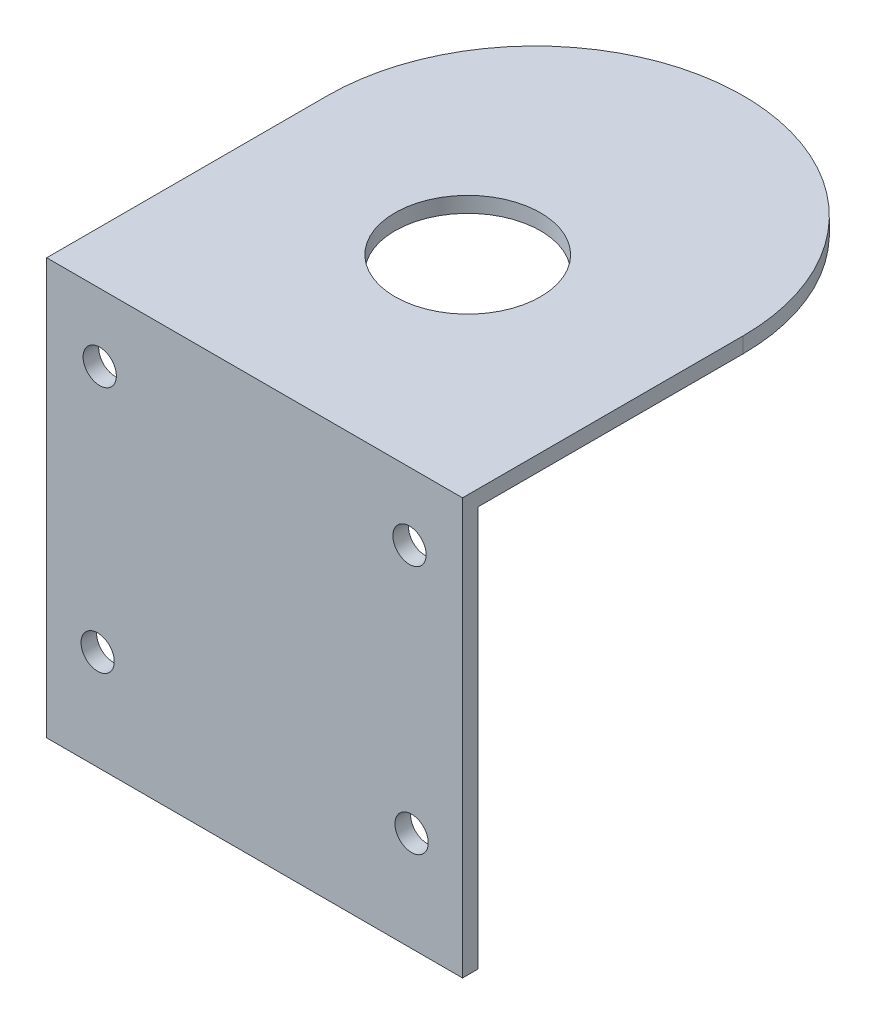
ISO-10303-21;
HEADER;
FILE_DESCRIPTION(('STEP AP214'),'2;1');
FILE_NAME('part.step','',(''),(''),'','','');
FILE_SCHEMA(('AUTOMOTIVE_DESIGN { 1 0 10303 214 1 1 1 1 }'));
ENDSEC;
DATA;
#1=APPLICATION_CONTEXT('core data for automotive mechanical design processes');
#2=APPLICATION_PROTOCOL_DEFINITION('international standard','automotive_design',2000,#1);
#3=PRODUCT_CONTEXT('',#1,'mechanical');
#4=PRODUCT('Part','Part','',(#3));
#5=PRODUCT_RELATED_PRODUCT_CATEGORY('part','',(#4));
#6=PRODUCT_DEFINITION_FORMATION('','',#4);
#7=PRODUCT_DEFINITION_CONTEXT('part definition',#1,'design');
#8=PRODUCT_DEFINITION('design','',#6,#7);
#9=PRODUCT_DEFINITION_SHAPE('','',#8);
#10=(LENGTH_UNIT() NAMED_UNIT(*) SI_UNIT(.MILLI.,.METRE.));
#11=(NAMED_UNIT(*) PLANE_ANGLE_UNIT() SI_UNIT($,.RADIAN.));
#12=(NAMED_UNIT(*) SI_UNIT($,.STERADIAN.) SOLID_ANGLE_UNIT());
#13=UNCERTAINTY_MEASURE_WITH_UNIT(LENGTH_MEASURE(1.E-05),#10,'distance_accuracy_value','');
#14=(GEOMETRIC_REPRESENTATION_CONTEXT(3) GLOBAL_UNCERTAINTY_ASSIGNED_CONTEXT((#13)) GLOBAL_UNIT_ASSIGNED_CONTEXT((#10,
#11,#12)) REPRESENTATION_CONTEXT('',''));
#15=CARTESIAN_POINT('',(0.,0.,0.));
#16=DIRECTION('',(0.,0.,1.));
#17=DIRECTION('',(1.,0.,0.));
#18=AXIS2_PLACEMENT_3D('',#15,#16,#17);
#19=CARTESIAN_POINT('',(-20.,20.,1.5));
#20=DIRECTION('',(0.,-1.,0.));
#21=DIRECTION('',(0.,0.,-1.));
#22=AXIS2_PLACEMENT_3D('',#19,#20,#21);
#23=PLANE('',#22);
#24=CARTESIAN_POINT('',(0.,20.,-19.));
#25=DIRECTION('',(0.,1.,0.));
#26=DIRECTION('',(0.,0.,1.));
#27=AXIS2_PLACEMENT_3D('',#24,#25,#26);
#28=CIRCLE('',#27,7.);
#29=CARTESIAN_POINT('',(0.,20.,-12.));
#30=VERTEX_POINT('',#29);
#31=EDGE_CURVE('E216',#30,#30,#28,.T.);
#32=ORIENTED_EDGE('',*,*,#31,.F.);
#33=EDGE_LOOP('',(#32));
#34=FACE_BOUND('',#33,.T.);
#35=CARTESIAN_POINT('',(0.,20.,-25.5));
#36=DIRECTION('',(0.,1.,0.));
#37=DIRECTION('',(0.,0.,1.));
#38=AXIS2_PLACEMENT_3D('',#35,#36,#37);
#39=CIRCLE('',#38,20.);
#40=CARTESIAN_POINT('',(20.,20.,-25.5));
#41=VERTEX_POINT('',#40);
#42=CARTESIAN_POINT('',(-20.,20.,-25.5));
#43=VERTEX_POINT('',#42);
#44=EDGE_CURVE('E125',#41,#43,#39,.T.);
#45=ORIENTED_EDGE('',*,*,#44,.T.);
#46=DIRECTION('',(0.,0.,-1.));
#47=VECTOR('',#46,1.);
#48=CARTESIAN_POINT('',(-20.,20.,1.5));
#49=LINE('',#48,#47);
#50=CARTESIAN_POINT('',(-20.,20.,1.5));
#51=VERTEX_POINT('',#50);
#52=EDGE_CURVE('E127',#51,#43,#49,.T.);
#53=ORIENTED_EDGE('',*,*,#52,.F.);
#54=DIRECTION('',(-1.,0.,0.));
#55=VECTOR('',#54,1.);
#56=CARTESIAN_POINT('',(-20.,20.,1.5));
#57=LINE('',#56,#55);
#58=CARTESIAN_POINT('',(20.,20.,1.5));
#59=VERTEX_POINT('',#58);
#60=EDGE_CURVE('E110',#59,#51,#57,.T.);
#61=ORIENTED_EDGE('',*,*,#60,.F.);
#62=DIRECTION('',(0.,0.,-1.));
#63=VECTOR('',#62,1.);
#64=CARTESIAN_POINT('',(20.,20.,1.5));
#65=LINE('',#64,#63);
#66=EDGE_CURVE('E71',#59,#41,#65,.T.);
#67=ORIENTED_EDGE('',*,*,#66,.T.);
#68=EDGE_LOOP('',(#45,#53,#61,#67));
#69=FACE_BOUND('',#68,.T.);
#70=ADVANCED_FACE('F61',(#34,#69),#23,.F.);
#71=CARTESIAN_POINT('',(-20.,18.5,-45.5));
#72=DIRECTION('',(0.,1.,0.));
#73=DIRECTION('',(-1.,0.,0.));
#74=AXIS2_PLACEMENT_3D('',#71,#72,#73);
#75=PLANE('',#74);
#76=CARTESIAN_POINT('',(0.,18.5,-19.));
#77=DIRECTION('',(0.,1.,0.));
#78=DIRECTION('',(-1.,0.,0.));
#79=AXIS2_PLACEMENT_3D('',#76,#77,#78);
#80=CIRCLE('',#79,7.);
#81=CARTESIAN_POINT('',(-7.,18.5,-19.));
#82=VERTEX_POINT('',#81);
#83=EDGE_CURVE('E65',#82,#82,#80,.T.);
#84=ORIENTED_EDGE('',*,*,#83,.T.);
#85=EDGE_LOOP('',(#84));
#86=FACE_BOUND('',#85,.T.);
#87=DIRECTION('',(0.,0.,1.));
#88=VECTOR('',#87,1.);
#89=CARTESIAN_POINT('',(-20.,18.5,-45.5));
#90=LINE('',#89,#88);
#91=CARTESIAN_POINT('',(-20.,18.5,-25.5));
#92=VERTEX_POINT('',#91);
#93=CARTESIAN_POINT('',(-20.,18.5,0.));
#94=VERTEX_POINT('',#93);
#95=EDGE_CURVE('E206',#92,#94,#90,.T.);
#96=ORIENTED_EDGE('',*,*,#95,.F.);
#97=CARTESIAN_POINT('',(0.,18.5,-25.5));
#98=DIRECTION('',(0.,1.,0.));
#99=DIRECTION('',(-1.,0.,0.));
#100=AXIS2_PLACEMENT_3D('',#97,#98,#99);
#101=CIRCLE('',#100,20.);
#102=CARTESIAN_POINT('',(20.,18.5,-25.5));
#103=VERTEX_POINT('',#102);
#104=EDGE_CURVE('E137',#103,#92,#101,.T.);
#105=ORIENTED_EDGE('',*,*,#104,.F.);
#106=DIRECTION('',(0.,0.,1.));
#107=VECTOR('',#106,1.);
#108=CARTESIAN_POINT('',(20.,18.5,-45.5));
#109=LINE('',#108,#107);
#110=CARTESIAN_POINT('',(20.,18.5,0.));
#111=VERTEX_POINT('',#110);
#112=EDGE_CURVE('E78',#103,#111,#109,.T.);
#113=ORIENTED_EDGE('',*,*,#112,.T.);
#114=DIRECTION('',(-1.,0.,0.));
#115=VECTOR('',#114,1.);
#116=CARTESIAN_POINT('',(-20.,18.5,0.));
#117=LINE('',#116,#115);
#118=EDGE_CURVE('E209',#111,#94,#117,.T.);
#119=ORIENTED_EDGE('',*,*,#118,.T.);
#120=EDGE_LOOP('',(#96,#105,#113,#119));
#121=FACE_BOUND('',#120,.T.);
#122=ADVANCED_FACE('F225',(#86,#121),#75,.F.);
#123=CARTESIAN_POINT('',(-20.,-20.,1.5));
#124=DIRECTION('',(1.,0.,0.));
#125=DIRECTION('',(0.,0.,-1.));
#126=AXIS2_PLACEMENT_3D('',#123,#124,#125);
#127=PLANE('',#126);
#128=DIRECTION('',(0.,1.,0.));
#129=VECTOR('',#128,1.);
#130=CARTESIAN_POINT('',(-20.,-20.,-25.5));
#131=LINE('',#130,#129);
#132=EDGE_CURVE('E12',#92,#43,#131,.T.);
#133=ORIENTED_EDGE('',*,*,#132,.F.);
#134=ORIENTED_EDGE('',*,*,#95,.T.);
#135=DIRECTION('',(0.,-1.,0.));
#136=VECTOR('',#135,1.);
#137=CARTESIAN_POINT('',(-20.,-20.,0.));
#138=LINE('',#137,#136);
#139=CARTESIAN_POINT('',(-20.,-20.,0.));
#140=VERTEX_POINT('',#139);
#141=EDGE_CURVE('E157',#94,#140,#138,.T.);
#142=ORIENTED_EDGE('',*,*,#141,.T.);
#143=DIRECTION('',(0.,0.,-1.));
#144=VECTOR('',#143,1.);
#145=CARTESIAN_POINT('',(-20.,-20.,1.5));
#146=LINE('',#145,#144);
#147=CARTESIAN_POINT('',(-20.,-20.,1.5));
#148=VERTEX_POINT('',#147);
#149=EDGE_CURVE('E144',#148,#140,#146,.T.);
#150=ORIENTED_EDGE('',*,*,#149,.F.);
#151=DIRECTION('',(0.,-1.,0.));
#152=VECTOR('',#151,1.);
#153=CARTESIAN_POINT('',(-20.,-20.,1.5));
#154=LINE('',#153,#152);
#155=EDGE_CURVE('E142',#51,#148,#154,.T.);
#156=ORIENTED_EDGE('',*,*,#155,.F.);
#157=ORIENTED_EDGE('',*,*,#52,.T.);
#158=EDGE_LOOP('',(#133,#134,#142,#150,#156,#157));
#159=FACE_BOUND('',#158,.T.);
#160=ADVANCED_FACE('F140',(#159),#127,.F.);
#161=CARTESIAN_POINT('',(0.,0.,1.5));
#162=DIRECTION('',(0.,0.,-1.));
#163=DIRECTION('',(-1.,0.,0.));
#164=AXIS2_PLACEMENT_3D('',#161,#162,#163);
#165=PLANE('',#164);
#166=DIRECTION('',(0.,1.,0.));
#167=VECTOR('',#166,1.);
#168=CARTESIAN_POINT('',(20.,-20.,1.5));
#169=LINE('',#168,#167);
#170=CARTESIAN_POINT('',(20.,-20.,1.5));
#171=VERTEX_POINT('',#170);
#172=EDGE_CURVE('E156',#171,#59,#169,.T.);
#173=ORIENTED_EDGE('',*,*,#172,.T.);
#174=ORIENTED_EDGE('',*,*,#60,.T.);
#175=ORIENTED_EDGE('',*,*,#155,.T.);
#176=DIRECTION('',(1.,0.,0.));
#177=VECTOR('',#176,1.);
#178=CARTESIAN_POINT('',(-20.,-20.,1.5));
#179=LINE('',#178,#177);
#180=EDGE_CURVE('E87',#148,#171,#179,.T.);
#181=ORIENTED_EDGE('',*,*,#180,.T.);
#182=EDGE_LOOP('',(#173,#174,#175,#181));
#183=FACE_BOUND('',#182,.T.);
#184=CARTESIAN_POINT('',(14.9,13.5,1.5));
#185=DIRECTION('',(0.,0.,1.));
#186=DIRECTION('',(1.,0.,0.));
#187=AXIS2_PLACEMENT_3D('',#184,#185,#186);
#188=CIRCLE('',#187,1.6);
#189=CARTESIAN_POINT('',(16.5,13.5,1.5));
#190=VERTEX_POINT('',#189);
#191=EDGE_CURVE('E164',#190,#190,#188,.T.);
#192=ORIENTED_EDGE('',*,*,#191,.F.);
#193=EDGE_LOOP('',(#192));
#194=FACE_BOUND('',#193,.T.);
#195=CARTESIAN_POINT('',(-14.9,13.5,1.5));
#196=DIRECTION('',(0.,0.,1.));
#197=DIRECTION('',(-1.,0.,0.));
#198=AXIS2_PLACEMENT_3D('',#195,#196,#197);
#199=CIRCLE('',#198,1.6);
#200=CARTESIAN_POINT('',(-16.5,13.5,1.5));
#201=VERTEX_POINT('',#200);
#202=EDGE_CURVE('E177',#201,#201,#199,.T.);
#203=ORIENTED_EDGE('',*,*,#202,.F.);
#204=EDGE_LOOP('',(#203));
#205=FACE_BOUND('',#204,.T.);
#206=CARTESIAN_POINT('',(15.1,-10.3991631652658,1.5));
#207=DIRECTION('',(0.,0.,1.));
#208=DIRECTION('',(1.,0.,0.));
#209=AXIS2_PLACEMENT_3D('',#206,#207,#208);
#210=CIRCLE('',#209,1.6);
#211=CARTESIAN_POINT('',(16.7,-10.3991631652658,1.5));
#212=VERTEX_POINT('',#211);
#213=EDGE_CURVE('E185',#212,#212,#210,.T.);
#214=ORIENTED_EDGE('',*,*,#213,.F.);
#215=EDGE_LOOP('',(#214));
#216=FACE_BOUND('',#215,.T.);
#217=CARTESIAN_POINT('',(-15.1,-10.3991631652658,1.5));
#218=DIRECTION('',(0.,0.,1.));
#219=DIRECTION('',(-1.,0.,0.));
#220=AXIS2_PLACEMENT_3D('',#217,#218,#219);
#221=CIRCLE('',#220,1.6);
#222=CARTESIAN_POINT('',(-16.7,-10.3991631652658,1.5));
#223=VERTEX_POINT('',#222);
#224=EDGE_CURVE('E193',#223,#223,#221,.T.);
#225=ORIENTED_EDGE('',*,*,#224,.F.);
#226=EDGE_LOOP('',(#225));
#227=FACE_BOUND('',#226,.T.);
#228=ADVANCED_FACE('F244',(#183,#194,#205,#216,#227),#165,.F.);
#229=CARTESIAN_POINT('',(0.,0.,0.));
#230=DIRECTION('',(0.,0.,-1.));
#231=DIRECTION('',(-1.,0.,0.));
#232=AXIS2_PLACEMENT_3D('',#229,#230,#231);
#233=PLANE('',#232);
#234=ORIENTED_EDGE('',*,*,#118,.F.);
#235=DIRECTION('',(0.,1.,0.));
#236=VECTOR('',#235,1.);
#237=CARTESIAN_POINT('',(20.,-20.,0.));
#238=LINE('',#237,#236);
#239=CARTESIAN_POINT('',(20.,-20.,0.));
#240=VERTEX_POINT('',#239);
#241=EDGE_CURVE('E160',#240,#111,#238,.T.);
#242=ORIENTED_EDGE('',*,*,#241,.F.);
#243=DIRECTION('',(1.,0.,0.));
#244=VECTOR('',#243,1.);
#245=CARTESIAN_POINT('',(-20.,-20.,0.));
#246=LINE('',#245,#244);
#247=EDGE_CURVE('E102',#140,#240,#246,.T.);
#248=ORIENTED_EDGE('',*,*,#247,.F.);
#249=ORIENTED_EDGE('',*,*,#141,.F.);
#250=EDGE_LOOP('',(#234,#242,#248,#249));
#251=FACE_BOUND('',#250,.T.);
#252=CARTESIAN_POINT('',(15.1,-10.3991631652658,0.));
#253=DIRECTION('',(0.,0.,1.));
#254=DIRECTION('',(1.,0.,0.));
#255=AXIS2_PLACEMENT_3D('',#252,#253,#254);
#256=CIRCLE('',#255,1.6);
#257=CARTESIAN_POINT('',(16.7,-10.3991631652658,0.));
#258=VERTEX_POINT('',#257);
#259=EDGE_CURVE('E189',#258,#258,#256,.T.);
#260=ORIENTED_EDGE('',*,*,#259,.T.);
#261=EDGE_LOOP('',(#260));
#262=FACE_BOUND('',#261,.T.);
#263=CARTESIAN_POINT('',(14.9,13.5,0.));
#264=DIRECTION('',(0.,0.,1.));
#265=DIRECTION('',(1.,0.,0.));
#266=AXIS2_PLACEMENT_3D('',#263,#264,#265);
#267=CIRCLE('',#266,1.6);
#268=CARTESIAN_POINT('',(16.5,13.5,0.));
#269=VERTEX_POINT('',#268);
#270=EDGE_CURVE('E173',#269,#269,#267,.T.);
#271=ORIENTED_EDGE('',*,*,#270,.T.);
#272=EDGE_LOOP('',(#271));
#273=FACE_BOUND('',#272,.T.);
#274=CARTESIAN_POINT('',(-14.9,13.5,0.));
#275=DIRECTION('',(0.,0.,1.));
#276=DIRECTION('',(-1.,0.,0.));
#277=AXIS2_PLACEMENT_3D('',#274,#275,#276);
#278=CIRCLE('',#277,1.6);
#279=CARTESIAN_POINT('',(-16.5,13.5,0.));
#280=VERTEX_POINT('',#279);
#281=EDGE_CURVE('E181',#280,#280,#278,.T.);
#282=ORIENTED_EDGE('',*,*,#281,.T.);
#283=EDGE_LOOP('',(#282));
#284=FACE_BOUND('',#283,.T.);
#285=CARTESIAN_POINT('',(-15.1,-10.3991631652658,0.));
#286=DIRECTION('',(0.,0.,1.));
#287=DIRECTION('',(-1.,0.,0.));
#288=AXIS2_PLACEMENT_3D('',#285,#286,#287);
#289=CIRCLE('',#288,1.6);
#290=CARTESIAN_POINT('',(-16.7,-10.3991631652658,0.));
#291=VERTEX_POINT('',#290);
#292=EDGE_CURVE('E197',#291,#291,#289,.T.);
#293=ORIENTED_EDGE('',*,*,#292,.T.);
#294=EDGE_LOOP('',(#293));
#295=FACE_BOUND('',#294,.T.);
#296=ADVANCED_FACE('F249',(#251,#262,#273,#284,#295),#233,.T.);
#297=CARTESIAN_POINT('',(20.,-20.,1.5));
#298=DIRECTION('',(-1.,0.,0.));
#299=DIRECTION('',(0.,0.,1.));
#300=AXIS2_PLACEMENT_3D('',#297,#298,#299);
#301=PLANE('',#300);
#302=ORIENTED_EDGE('',*,*,#112,.F.);
#303=DIRECTION('',(0.,1.,0.));
#304=VECTOR('',#303,1.);
#305=CARTESIAN_POINT('',(20.,-20.,-25.5));
#306=LINE('',#305,#304);
#307=EDGE_CURVE('E133',#103,#41,#306,.T.);
#308=ORIENTED_EDGE('',*,*,#307,.T.);
#309=ORIENTED_EDGE('',*,*,#66,.F.);
#310=ORIENTED_EDGE('',*,*,#172,.F.);
#311=DIRECTION('',(0.,0.,-1.));
#312=VECTOR('',#311,1.);
#313=CARTESIAN_POINT('',(20.,-20.,1.5));
#314=LINE('',#313,#312);
#315=EDGE_CURVE('E149',#171,#240,#314,.T.);
#316=ORIENTED_EDGE('',*,*,#315,.T.);
#317=ORIENTED_EDGE('',*,*,#241,.T.);
#318=EDGE_LOOP('',(#302,#308,#309,#310,#316,#317));
#319=FACE_BOUND('',#318,.T.);
#320=ADVANCED_FACE('F63',(#319),#301,.F.);
#321=CARTESIAN_POINT('',(-20.,-20.,1.5));
#322=DIRECTION('',(0.,1.,0.));
#323=DIRECTION('',(0.,0.,1.));
#324=AXIS2_PLACEMENT_3D('',#321,#322,#323);
#325=PLANE('',#324);
#326=ORIENTED_EDGE('',*,*,#247,.T.);
#327=ORIENTED_EDGE('',*,*,#315,.F.);
#328=ORIENTED_EDGE('',*,*,#180,.F.);
#329=ORIENTED_EDGE('',*,*,#149,.T.);
#330=EDGE_LOOP('',(#326,#327,#328,#329));
#331=FACE_BOUND('',#330,.T.);
#332=ADVANCED_FACE('F245',(#331),#325,.F.);
#333=CARTESIAN_POINT('',(14.9,13.5,1.5));
#334=DIRECTION('',(0.,0.,-1.));
#335=DIRECTION('',(-1.,0.,0.));
#336=AXIS2_PLACEMENT_3D('',#333,#334,#335);
#337=CYLINDRICAL_SURFACE('',#336,1.6);
#338=ORIENTED_EDGE('',*,*,#191,.T.);
#339=EDGE_LOOP('',(#338));
#340=FACE_BOUND('',#339,.T.);
#341=ORIENTED_EDGE('',*,*,#270,.F.);
#342=EDGE_LOOP('',(#341));
#343=FACE_BOUND('',#342,.T.);
#344=ADVANCED_FACE('F248',(#340,#343),#337,.F.);
#345=CARTESIAN_POINT('',(-14.9,13.5,1.5));
#346=DIRECTION('',(0.,0.,-1.));
#347=DIRECTION('',(-1.,0.,0.));
#348=AXIS2_PLACEMENT_3D('',#345,#346,#347);
#349=CYLINDRICAL_SURFACE('',#348,1.6);
#350=ORIENTED_EDGE('',*,*,#202,.T.);
#351=EDGE_LOOP('',(#350));
#352=FACE_BOUND('',#351,.T.);
#353=ORIENTED_EDGE('',*,*,#281,.F.);
#354=EDGE_LOOP('',(#353));
#355=FACE_BOUND('',#354,.T.);
#356=ADVANCED_FACE('F257',(#352,#355),#349,.F.);
#357=CARTESIAN_POINT('',(15.1,-10.3991631652658,1.5));
#358=DIRECTION('',(0.,0.,-1.));
#359=DIRECTION('',(-1.,0.,0.));
#360=AXIS2_PLACEMENT_3D('',#357,#358,#359);
#361=CYLINDRICAL_SURFACE('',#360,1.6);
#362=ORIENTED_EDGE('',*,*,#213,.T.);
#363=EDGE_LOOP('',(#362));
#364=FACE_BOUND('',#363,.T.);
#365=ORIENTED_EDGE('',*,*,#259,.F.);
#366=EDGE_LOOP('',(#365));
#367=FACE_BOUND('',#366,.T.);
#368=ADVANCED_FACE('F261',(#364,#367),#361,.F.);
#369=CARTESIAN_POINT('',(-15.1,-10.3991631652658,1.5));
#370=DIRECTION('',(0.,0.,-1.));
#371=DIRECTION('',(-1.,0.,0.));
#372=AXIS2_PLACEMENT_3D('',#369,#370,#371);
#373=CYLINDRICAL_SURFACE('',#372,1.6);
#374=ORIENTED_EDGE('',*,*,#224,.T.);
#375=EDGE_LOOP('',(#374));
#376=FACE_BOUND('',#375,.T.);
#377=ORIENTED_EDGE('',*,*,#292,.F.);
#378=EDGE_LOOP('',(#377));
#379=FACE_BOUND('',#378,.T.);
#380=ADVANCED_FACE('F233',(#376,#379),#373,.F.);
#381=CARTESIAN_POINT('',(0.,-20.,-25.5));
#382=DIRECTION('',(0.,1.,0.));
#383=DIRECTION('',(0.,0.,1.));
#384=AXIS2_PLACEMENT_3D('',#381,#382,#383);
#385=CYLINDRICAL_SURFACE('',#384,20.);
#386=ORIENTED_EDGE('',*,*,#104,.T.);
#387=ORIENTED_EDGE('',*,*,#132,.T.);
#388=ORIENTED_EDGE('',*,*,#44,.F.);
#389=ORIENTED_EDGE('',*,*,#307,.F.);
#390=EDGE_LOOP('',(#386,#387,#388,#389));
#391=FACE_BOUND('',#390,.T.);
#392=ADVANCED_FACE('F136',(#391),#385,.T.);
#393=CARTESIAN_POINT('',(0.,-20.,-19.));
#394=DIRECTION('',(0.,1.,0.));
#395=DIRECTION('',(0.,0.,1.));
#396=AXIS2_PLACEMENT_3D('',#393,#394,#395);
#397=CYLINDRICAL_SURFACE('',#396,7.);
#398=ORIENTED_EDGE('',*,*,#31,.T.);
#399=EDGE_LOOP('',(#398));
#400=FACE_BOUND('',#399,.T.);
#401=ORIENTED_EDGE('',*,*,#83,.F.);
#402=EDGE_LOOP('',(#401));
#403=FACE_BOUND('',#402,.T.);
#404=ADVANCED_FACE('F227',(#400,#403),#397,.F.);
#405=CLOSED_SHELL('',(#70,#122,#160,#228,#296,#320,#332,#344,#356,#368,#380,#392,#404));
#406=MANIFOLD_SOLID_BREP('B2',#405);
#407=ADVANCED_BREP_SHAPE_REPRESENTATION('',(#18,#406),#14);
#408=SHAPE_DEFINITION_REPRESENTATION(#9,#407);
ENDSEC;
END-ISO-10303-21;
